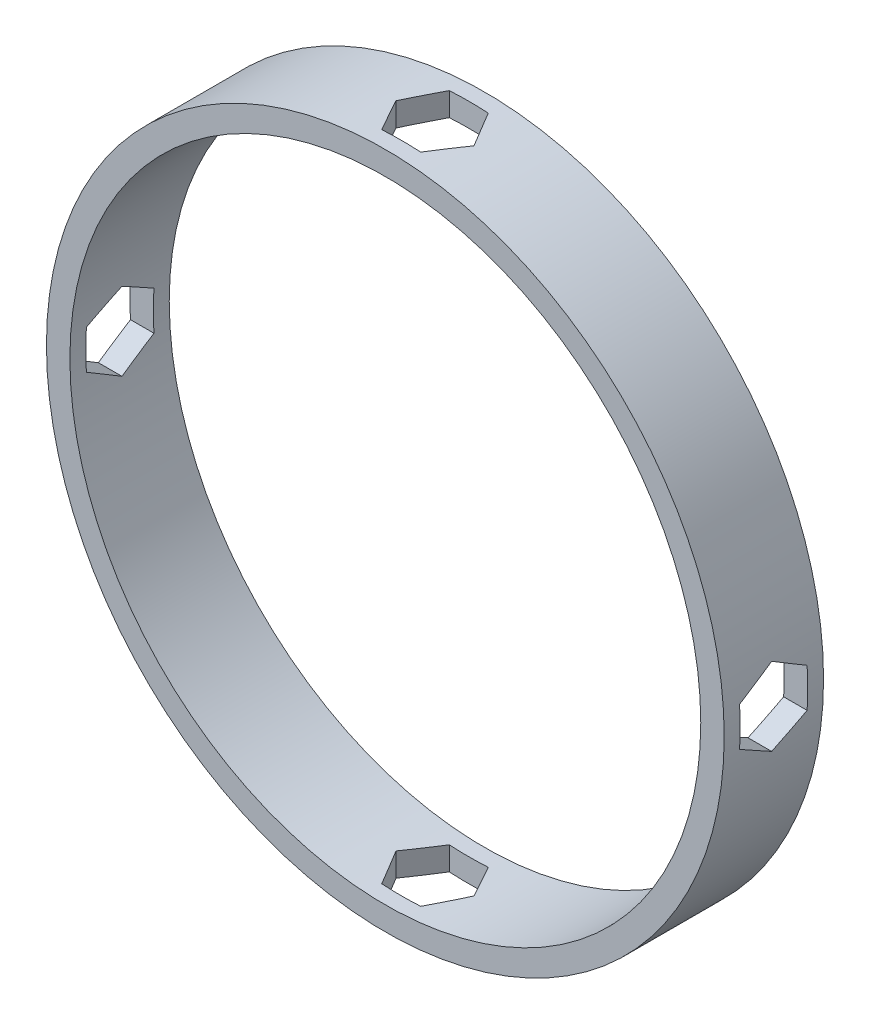
ISO-10303-21;
HEADER;
FILE_DESCRIPTION(('STEP AP214'),'2;1');
FILE_NAME('part.step','',(''),(''),'','','');
FILE_SCHEMA(('AUTOMOTIVE_DESIGN { 1 0 10303 214 1 1 1 1 }'));
ENDSEC;
DATA;
#1=APPLICATION_CONTEXT('core data for automotive mechanical design processes');
#2=APPLICATION_PROTOCOL_DEFINITION('international standard','automotive_design',2000,#1);
#3=PRODUCT_CONTEXT('',#1,'mechanical');
#4=PRODUCT('Part','Part','',(#3));
#5=PRODUCT_RELATED_PRODUCT_CATEGORY('part','',(#4));
#6=PRODUCT_DEFINITION_FORMATION('','',#4);
#7=PRODUCT_DEFINITION_CONTEXT('part definition',#1,'design');
#8=PRODUCT_DEFINITION('design','',#6,#7);
#9=PRODUCT_DEFINITION_SHAPE('','',#8);
#10=(LENGTH_UNIT() NAMED_UNIT(*) SI_UNIT(.MILLI.,.METRE.));
#11=(NAMED_UNIT(*) PLANE_ANGLE_UNIT() SI_UNIT($,.RADIAN.));
#12=(NAMED_UNIT(*) SI_UNIT($,.STERADIAN.) SOLID_ANGLE_UNIT());
#13=UNCERTAINTY_MEASURE_WITH_UNIT(LENGTH_MEASURE(1.E-05),#10,'distance_accuracy_value','');
#14=(GEOMETRIC_REPRESENTATION_CONTEXT(3) GLOBAL_UNCERTAINTY_ASSIGNED_CONTEXT((#13)) GLOBAL_UNIT_ASSIGNED_CONTEXT((#10,
#11,#12)) REPRESENTATION_CONTEXT('',''));
#15=CARTESIAN_POINT('',(0.,0.,0.));
#16=DIRECTION('',(0.,0.,1.));
#17=DIRECTION('',(1.,0.,0.));
#18=AXIS2_PLACEMENT_3D('',#15,#16,#17);
#19=CARTESIAN_POINT('',(0.,0.,11.5));
#20=DIRECTION('',(0.,0.,-1.));
#21=DIRECTION('',(-1.,0.,0.));
#22=AXIS2_PLACEMENT_3D('',#19,#20,#21);
#23=CYLINDRICAL_SURFACE('',#22,34.11);
#24=CARTESIAN_POINT('',(0.,0.,0.));
#25=DIRECTION('',(0.,0.,1.));
#26=DIRECTION('',(1.,0.,0.));
#27=AXIS2_PLACEMENT_3D('',#24,#25,#26);
#28=CIRCLE('',#27,34.11);
#29=CARTESIAN_POINT('',(34.11,0.,0.));
#30=VERTEX_POINT('',#29);
#31=EDGE_CURVE('E359',#30,#30,#28,.T.);
#32=ORIENTED_EDGE('',*,*,#31,.T.);
#33=EDGE_LOOP('',(#32));
#34=FACE_BOUND('',#33,.T.);
#35=CARTESIAN_POINT('',(0.,0.,-1.8));
#36=DIRECTION('',(-0.866025403784439,0.,-0.5));
#37=DIRECTION('',(0.5,0.,-0.866025403784439));
#38=AXIS2_PLACEMENT_3D('',#35,#36,#37);
#39=ELLIPSE('',#38,68.22,34.11);
#40=CARTESIAN_POINT('',(-3.92598183048945,33.8833110345885,5.));
#41=VERTEX_POINT('',#40);
#42=CARTESIAN_POINT('',(-1.96299091524473,34.053469231,1.6));
#43=VERTEX_POINT('',#42);
#44=EDGE_CURVE('E345',#41,#43,#39,.T.);
#45=ORIENTED_EDGE('',*,*,#44,.T.);
#46=CARTESIAN_POINT('',(0.,0.,1.6));
#47=DIRECTION('',(0.,0.,-1.));
#48=DIRECTION('',(-1.,0.,0.));
#49=AXIS2_PLACEMENT_3D('',#46,#47,#48);
#50=CIRCLE('',#49,34.11);
#51=CARTESIAN_POINT('',(1.96299091524472,34.0534692310001,1.6));
#52=VERTEX_POINT('',#51);
#53=EDGE_CURVE('E343',#43,#52,#50,.T.);
#54=ORIENTED_EDGE('',*,*,#53,.T.);
#55=CARTESIAN_POINT('',(0.,0.,-1.79999999999999));
#56=DIRECTION('',(0.866025403784438,0.,-0.500000000000001));
#57=DIRECTION('',(-0.500000000000001,0.,-0.866025403784438));
#58=AXIS2_PLACEMENT_3D('',#55,#56,#57);
#59=ELLIPSE('',#58,68.2199999999999,34.11);
#60=CARTESIAN_POINT('',(3.92598183048946,33.8833110345885,5.));
#61=VERTEX_POINT('',#60);
#62=EDGE_CURVE('E327',#52,#61,#59,.T.);
#63=ORIENTED_EDGE('',*,*,#62,.T.);
#64=CARTESIAN_POINT('',(0.,0.,11.8));
#65=DIRECTION('',(0.866025403784438,0.,0.5));
#66=DIRECTION('',(0.5,0.,-0.866025403784439));
#67=AXIS2_PLACEMENT_3D('',#64,#65,#66);
#68=ELLIPSE('',#67,68.22,34.11);
#69=CARTESIAN_POINT('',(1.96299091524473,34.053469231,8.4));
#70=VERTEX_POINT('',#69);
#71=EDGE_CURVE('E353',#61,#70,#68,.T.);
#72=ORIENTED_EDGE('',*,*,#71,.T.);
#73=CARTESIAN_POINT('',(0.,0.,8.4));
#74=DIRECTION('',(0.,0.,1.));
#75=DIRECTION('',(1.,0.,0.));
#76=AXIS2_PLACEMENT_3D('',#73,#74,#75);
#77=CIRCLE('',#76,34.11);
#78=CARTESIAN_POINT('',(-1.96299091524473,34.053469231,8.4));
#79=VERTEX_POINT('',#78);
#80=EDGE_CURVE('E351',#70,#79,#77,.T.);
#81=ORIENTED_EDGE('',*,*,#80,.T.);
#82=CARTESIAN_POINT('',(0.,0.,11.8));
#83=DIRECTION('',(-0.866025403784439,0.,0.5));
#84=DIRECTION('',(-0.5,0.,-0.866025403784439));
#85=AXIS2_PLACEMENT_3D('',#82,#83,#84);
#86=ELLIPSE('',#85,68.22,34.11);
#87=EDGE_CURVE('E348',#79,#41,#86,.T.);
#88=ORIENTED_EDGE('',*,*,#87,.T.);
#89=EDGE_LOOP('',(#45,#54,#63,#72,#81,#88));
#90=FACE_BOUND('',#89,.T.);
#91=CARTESIAN_POINT('',(0.,0.,-1.79999999999999));
#92=DIRECTION('',(0.,0.866025403784438,-0.500000000000001));
#93=DIRECTION('',(0.,-0.500000000000001,-0.866025403784438));
#94=AXIS2_PLACEMENT_3D('',#91,#92,#93);
#95=ELLIPSE('',#94,68.2199999999999,34.11);
#96=CARTESIAN_POINT('',(-34.053469231,1.96299091524508,1.6));
#97=VERTEX_POINT('',#96);
#98=CARTESIAN_POINT('',(-33.8833110345885,3.92598183048981,5.00000000000001));
#99=VERTEX_POINT('',#98);
#100=EDGE_CURVE('E279',#97,#99,#95,.T.);
#101=ORIENTED_EDGE('',*,*,#100,.T.);
#102=CARTESIAN_POINT('',(0.,0.,11.8));
#103=DIRECTION('',(0.,0.866025403784438,0.5));
#104=DIRECTION('',(0.,0.5,-0.866025403784439));
#105=AXIS2_PLACEMENT_3D('',#102,#103,#104);
#106=ELLIPSE('',#105,68.22,34.11);
#107=CARTESIAN_POINT('',(-34.053469231,1.96299091524509,8.4));
#108=VERTEX_POINT('',#107);
#109=EDGE_CURVE('E234',#99,#108,#106,.T.);
#110=ORIENTED_EDGE('',*,*,#109,.T.);
#111=CARTESIAN_POINT('',(0.,0.,8.4));
#112=DIRECTION('',(0.,0.,1.));
#113=DIRECTION('',(0.,1.,0.));
#114=AXIS2_PLACEMENT_3D('',#111,#112,#113);
#115=CIRCLE('',#114,34.11);
#116=CARTESIAN_POINT('',(-34.0534692310001,-1.96299091524437,8.4));
#117=VERTEX_POINT('',#116);
#118=EDGE_CURVE('E316',#108,#117,#115,.T.);
#119=ORIENTED_EDGE('',*,*,#118,.T.);
#120=CARTESIAN_POINT('',(0.,0.,11.8));
#121=DIRECTION('',(0.,-0.866025403784439,0.5));
#122=DIRECTION('',(0.,-0.5,-0.866025403784439));
#123=AXIS2_PLACEMENT_3D('',#120,#121,#122);
#124=ELLIPSE('',#123,68.22,34.11);
#125=CARTESIAN_POINT('',(-33.8833110345885,-3.9259818304891,5.));
#126=VERTEX_POINT('',#125);
#127=EDGE_CURVE('E308',#117,#126,#124,.T.);
#128=ORIENTED_EDGE('',*,*,#127,.T.);
#129=CARTESIAN_POINT('',(0.,0.,-1.8));
#130=DIRECTION('',(0.,-0.866025403784439,-0.5));
#131=DIRECTION('',(0.,0.5,-0.866025403784439));
#132=AXIS2_PLACEMENT_3D('',#129,#130,#131);
#133=ELLIPSE('',#132,68.22,34.11);
#134=CARTESIAN_POINT('',(-34.0534692310001,-1.96299091524437,1.6));
#135=VERTEX_POINT('',#134);
#136=EDGE_CURVE('E300',#126,#135,#133,.T.);
#137=ORIENTED_EDGE('',*,*,#136,.T.);
#138=CARTESIAN_POINT('',(0.,0.,1.6));
#139=DIRECTION('',(0.,0.,-1.));
#140=DIRECTION('',(0.,-1.,0.));
#141=AXIS2_PLACEMENT_3D('',#138,#139,#140);
#142=CIRCLE('',#141,34.11);
#143=EDGE_CURVE('E292',#135,#97,#142,.T.);
#144=ORIENTED_EDGE('',*,*,#143,.T.);
#145=EDGE_LOOP('',(#101,#110,#119,#128,#137,#144));
#146=FACE_BOUND('',#145,.T.);
#147=CARTESIAN_POINT('',(0.,0.,-1.79999999999999));
#148=DIRECTION('',(-0.866025403784438,0.,-0.500000000000001));
#149=DIRECTION('',(0.500000000000001,0.,-0.866025403784438));
#150=AXIS2_PLACEMENT_3D('',#147,#148,#149);
#151=ELLIPSE('',#150,68.2199999999999,34.11);
#152=CARTESIAN_POINT('',(-1.96299091524472,-34.0534692310001,1.6));
#153=VERTEX_POINT('',#152);
#154=CARTESIAN_POINT('',(-3.92598183048946,-33.8833110345885,5.00000000000001));
#155=VERTEX_POINT('',#154);
#156=EDGE_CURVE('E233',#153,#155,#151,.T.);
#157=ORIENTED_EDGE('',*,*,#156,.T.);
#158=CARTESIAN_POINT('',(0.,0.,11.8));
#159=DIRECTION('',(-0.866025403784438,0.,0.5));
#160=DIRECTION('',(-0.5,0.,-0.866025403784439));
#161=AXIS2_PLACEMENT_3D('',#158,#159,#160);
#162=ELLIPSE('',#161,68.22,34.11);
#163=CARTESIAN_POINT('',(-1.96299091524473,-34.053469231,8.4));
#164=VERTEX_POINT('',#163);
#165=EDGE_CURVE('E62',#155,#164,#162,.T.);
#166=ORIENTED_EDGE('',*,*,#165,.T.);
#167=CARTESIAN_POINT('',(0.,0.,8.4));
#168=DIRECTION('',(0.,0.,1.));
#169=DIRECTION('',(-1.,0.,0.));
#170=AXIS2_PLACEMENT_3D('',#167,#168,#169);
#171=CIRCLE('',#170,34.11);
#172=CARTESIAN_POINT('',(1.96299091524473,-34.053469231,8.4));
#173=VERTEX_POINT('',#172);
#174=EDGE_CURVE('E270',#164,#173,#171,.T.);
#175=ORIENTED_EDGE('',*,*,#174,.T.);
#176=CARTESIAN_POINT('',(0.,0.,11.8));
#177=DIRECTION('',(0.866025403784439,0.,0.5));
#178=DIRECTION('',(0.5,0.,-0.866025403784439));
#179=AXIS2_PLACEMENT_3D('',#176,#177,#178);
#180=ELLIPSE('',#179,68.22,34.11);
#181=CARTESIAN_POINT('',(3.92598183048945,-33.8833110345885,5.));
#182=VERTEX_POINT('',#181);
#183=EDGE_CURVE('E262',#173,#182,#180,.T.);
#184=ORIENTED_EDGE('',*,*,#183,.T.);
#185=CARTESIAN_POINT('',(0.,0.,-1.8));
#186=DIRECTION('',(0.866025403784439,0.,-0.5));
#187=DIRECTION('',(-0.5,0.,-0.866025403784439));
#188=AXIS2_PLACEMENT_3D('',#185,#186,#187);
#189=ELLIPSE('',#188,68.22,34.11);
#190=CARTESIAN_POINT('',(1.96299091524473,-34.053469231,1.6));
#191=VERTEX_POINT('',#190);
#192=EDGE_CURVE('E254',#182,#191,#189,.T.);
#193=ORIENTED_EDGE('',*,*,#192,.T.);
#194=CARTESIAN_POINT('',(0.,0.,1.6));
#195=DIRECTION('',(0.,0.,-1.));
#196=DIRECTION('',(1.,0.,0.));
#197=AXIS2_PLACEMENT_3D('',#194,#195,#196);
#198=CIRCLE('',#197,34.11);
#199=EDGE_CURVE('E246',#191,#153,#198,.T.);
#200=ORIENTED_EDGE('',*,*,#199,.T.);
#201=EDGE_LOOP('',(#157,#166,#175,#184,#193,#200));
#202=FACE_BOUND('',#201,.T.);
#203=CARTESIAN_POINT('',(0.,0.,-1.79999999999999));
#204=DIRECTION('',(0.,-0.866025403784438,-0.500000000000001));
#205=DIRECTION('',(0.,0.500000000000001,-0.866025403784438));
#206=AXIS2_PLACEMENT_3D('',#203,#204,#205);
#207=ELLIPSE('',#206,68.2199999999999,34.11);
#208=CARTESIAN_POINT('',(34.053469231,-1.96299091524484,1.6));
#209=VERTEX_POINT('',#208);
#210=CARTESIAN_POINT('',(33.8833110345885,-3.92598183048958,5.00000000000001));
#211=VERTEX_POINT('',#210);
#212=EDGE_CURVE('E210',#209,#211,#207,.T.);
#213=ORIENTED_EDGE('',*,*,#212,.T.);
#214=CARTESIAN_POINT('',(0.,0.,11.8));
#215=DIRECTION('',(0.,-0.866025403784438,0.5));
#216=DIRECTION('',(0.,-0.5,-0.866025403784439));
#217=AXIS2_PLACEMENT_3D('',#214,#215,#216);
#218=ELLIPSE('',#217,68.22,34.11);
#219=CARTESIAN_POINT('',(34.053469231,-1.96299091524485,8.4));
#220=VERTEX_POINT('',#219);
#221=EDGE_CURVE('E54',#211,#220,#218,.T.);
#222=ORIENTED_EDGE('',*,*,#221,.T.);
#223=CARTESIAN_POINT('',(0.,0.,8.4));
#224=DIRECTION('',(0.,0.,1.));
#225=DIRECTION('',(0.,-1.,0.));
#226=AXIS2_PLACEMENT_3D('',#223,#224,#225);
#227=CIRCLE('',#226,34.11);
#228=CARTESIAN_POINT('',(34.0534692310001,1.96299091524461,8.4));
#229=VERTEX_POINT('',#228);
#230=EDGE_CURVE('E223',#220,#229,#227,.T.);
#231=ORIENTED_EDGE('',*,*,#230,.T.);
#232=CARTESIAN_POINT('',(0.,0.,11.8));
#233=DIRECTION('',(0.,0.866025403784439,0.5));
#234=DIRECTION('',(0.,0.5,-0.866025403784439));
#235=AXIS2_PLACEMENT_3D('',#232,#233,#234);
#236=ELLIPSE('',#235,68.22,34.11);
#237=CARTESIAN_POINT('',(33.8833110345885,3.92598183048934,5.));
#238=VERTEX_POINT('',#237);
#239=EDGE_CURVE('E707',#229,#238,#236,.T.);
#240=ORIENTED_EDGE('',*,*,#239,.T.);
#241=CARTESIAN_POINT('',(0.,0.,-1.8));
#242=DIRECTION('',(0.,0.866025403784439,-0.5));
#243=DIRECTION('',(0.,-0.5,-0.866025403784439));
#244=AXIS2_PLACEMENT_3D('',#241,#242,#243);
#245=ELLIPSE('',#244,68.22,34.11);
#246=CARTESIAN_POINT('',(34.0534692310001,1.96299091524461,1.6));
#247=VERTEX_POINT('',#246);
#248=EDGE_CURVE('E699',#238,#247,#245,.T.);
#249=ORIENTED_EDGE('',*,*,#248,.T.);
#250=CARTESIAN_POINT('',(0.,0.,1.6));
#251=DIRECTION('',(0.,0.,-1.));
#252=DIRECTION('',(0.,1.,0.));
#253=AXIS2_PLACEMENT_3D('',#250,#251,#252);
#254=CIRCLE('',#253,34.11);
#255=EDGE_CURVE('E692',#247,#209,#254,.T.);
#256=ORIENTED_EDGE('',*,*,#255,.T.);
#257=EDGE_LOOP('',(#213,#222,#231,#240,#249,#256));
#258=FACE_BOUND('',#257,.T.);
#259=CARTESIAN_POINT('',(0.,0.,10.));
#260=DIRECTION('',(0.,0.,1.));
#261=DIRECTION('',(1.,0.,0.));
#262=AXIS2_PLACEMENT_3D('',#259,#260,#261);
#263=CIRCLE('',#262,34.11);
#264=CARTESIAN_POINT('',(34.11,0.,10.));
#265=VERTEX_POINT('',#264);
#266=EDGE_CURVE('E682',#265,#265,#263,.T.);
#267=ORIENTED_EDGE('',*,*,#266,.F.);
#268=EDGE_LOOP('',(#267));
#269=FACE_BOUND('',#268,.T.);
#270=ADVANCED_FACE('F39',(#34,#90,#146,#202,#258,#269),#23,.T.);
#271=CARTESIAN_POINT('',(0.,0.,11.5));
#272=DIRECTION('',(0.,0.,-1.));
#273=DIRECTION('',(-1.,0.,0.));
#274=AXIS2_PLACEMENT_3D('',#271,#272,#273);
#275=CYLINDRICAL_SURFACE('',#274,31.75);
#276=CARTESIAN_POINT('',(0.,0.,0.));
#277=DIRECTION('',(0.,0.,1.));
#278=DIRECTION('',(1.,0.,0.));
#279=AXIS2_PLACEMENT_3D('',#276,#277,#278);
#280=CIRCLE('',#279,31.75);
#281=CARTESIAN_POINT('',(31.75,0.,0.));
#282=VERTEX_POINT('',#281);
#283=EDGE_CURVE('E356',#282,#282,#280,.T.);
#284=ORIENTED_EDGE('',*,*,#283,.F.);
#285=EDGE_LOOP('',(#284));
#286=FACE_BOUND('',#285,.T.);
#287=CARTESIAN_POINT('',(0.,0.,11.8));
#288=DIRECTION('',(0.866025403784438,0.,0.5));
#289=DIRECTION('',(0.5,0.,-0.866025403784439));
#290=AXIS2_PLACEMENT_3D('',#287,#288,#289);
#291=ELLIPSE('',#290,63.5,31.75);
#292=CARTESIAN_POINT('',(3.92598183048946,31.5063353417478,5.));
#293=VERTEX_POINT('',#292);
#294=CARTESIAN_POINT('',(1.96299091524473,31.6892594843532,8.4));
#295=VERTEX_POINT('',#294);
#296=EDGE_CURVE('E11',#293,#295,#291,.T.);
#297=ORIENTED_EDGE('',*,*,#296,.F.);
#298=CARTESIAN_POINT('',(0.,0.,-1.79999999999999));
#299=DIRECTION('',(0.866025403784438,0.,-0.500000000000001));
#300=DIRECTION('',(-0.500000000000001,0.,-0.866025403784438));
#301=AXIS2_PLACEMENT_3D('',#298,#299,#300);
#302=ELLIPSE('',#301,63.4999999999999,31.75);
#303=CARTESIAN_POINT('',(1.96299091524472,31.6892594843532,1.6));
#304=VERTEX_POINT('',#303);
#305=EDGE_CURVE('E362',#304,#293,#302,.T.);
#306=ORIENTED_EDGE('',*,*,#305,.F.);
#307=CARTESIAN_POINT('',(0.,0.,1.6));
#308=DIRECTION('',(0.,0.,-1.));
#309=DIRECTION('',(-1.,0.,0.));
#310=AXIS2_PLACEMENT_3D('',#307,#308,#309);
#311=CIRCLE('',#310,31.75);
#312=CARTESIAN_POINT('',(-1.96299091524473,31.6892594843532,1.6));
#313=VERTEX_POINT('',#312);
#314=EDGE_CURVE('E364',#313,#304,#311,.T.);
#315=ORIENTED_EDGE('',*,*,#314,.F.);
#316=CARTESIAN_POINT('',(0.,0.,-1.8));
#317=DIRECTION('',(-0.866025403784439,0.,-0.5));
#318=DIRECTION('',(0.5,0.,-0.866025403784439));
#319=AXIS2_PLACEMENT_3D('',#316,#317,#318);
#320=ELLIPSE('',#319,63.5,31.75);
#321=CARTESIAN_POINT('',(-3.92598183048945,31.5063353417478,5.));
#322=VERTEX_POINT('',#321);
#323=EDGE_CURVE('E367',#322,#313,#320,.T.);
#324=ORIENTED_EDGE('',*,*,#323,.F.);
#325=CARTESIAN_POINT('',(0.,0.,11.8));
#326=DIRECTION('',(-0.866025403784439,0.,0.5));
#327=DIRECTION('',(-0.5,0.,-0.866025403784439));
#328=AXIS2_PLACEMENT_3D('',#325,#326,#327);
#329=ELLIPSE('',#328,63.5,31.75);
#330=CARTESIAN_POINT('',(-1.96299091524473,31.6892594843532,8.4));
#331=VERTEX_POINT('',#330);
#332=EDGE_CURVE('E369',#331,#322,#329,.T.);
#333=ORIENTED_EDGE('',*,*,#332,.F.);
#334=CARTESIAN_POINT('',(0.,0.,8.4));
#335=DIRECTION('',(0.,0.,1.));
#336=DIRECTION('',(1.,0.,0.));
#337=AXIS2_PLACEMENT_3D('',#334,#335,#336);
#338=CIRCLE('',#337,31.75);
#339=EDGE_CURVE('E47',#295,#331,#338,.T.);
#340=ORIENTED_EDGE('',*,*,#339,.F.);
#341=EDGE_LOOP('',(#297,#306,#315,#324,#333,#340));
#342=FACE_BOUND('',#341,.T.);
#343=CARTESIAN_POINT('',(0.,0.,11.8));
#344=DIRECTION('',(0.,0.866025403784438,0.5));
#345=DIRECTION('',(0.,0.5,-0.866025403784439));
#346=AXIS2_PLACEMENT_3D('',#343,#344,#345);
#347=ELLIPSE('',#346,63.5,31.75);
#348=CARTESIAN_POINT('',(-31.5063353417478,3.92598183048979,5.));
#349=VERTEX_POINT('',#348);
#350=CARTESIAN_POINT('',(-31.6892594843531,1.96299091524506,8.4));
#351=VERTEX_POINT('',#350);
#352=EDGE_CURVE('E319',#349,#351,#347,.T.);
#353=ORIENTED_EDGE('',*,*,#352,.F.);
#354=CARTESIAN_POINT('',(0.,0.,-1.79999999999999));
#355=DIRECTION('',(0.,0.866025403784438,-0.500000000000001));
#356=DIRECTION('',(0.,-0.500000000000001,-0.866025403784438));
#357=AXIS2_PLACEMENT_3D('',#354,#355,#356);
#358=ELLIPSE('',#357,63.4999999999999,31.75);
#359=CARTESIAN_POINT('',(-31.6892594843531,1.96299091524506,1.6));
#360=VERTEX_POINT('',#359);
#361=EDGE_CURVE('E277',#360,#349,#358,.T.);
#362=ORIENTED_EDGE('',*,*,#361,.F.);
#363=CARTESIAN_POINT('',(0.,0.,1.6));
#364=DIRECTION('',(0.,0.,-1.));
#365=DIRECTION('',(0.,-1.,0.));
#366=AXIS2_PLACEMENT_3D('',#363,#364,#365);
#367=CIRCLE('',#366,31.75);
#368=CARTESIAN_POINT('',(-31.6892594843532,-1.96299091524439,1.6));
#369=VERTEX_POINT('',#368);
#370=EDGE_CURVE('E290',#369,#360,#367,.T.);
#371=ORIENTED_EDGE('',*,*,#370,.F.);
#372=CARTESIAN_POINT('',(0.,0.,-1.8));
#373=DIRECTION('',(0.,-0.866025403784439,-0.5));
#374=DIRECTION('',(0.,0.5,-0.866025403784439));
#375=AXIS2_PLACEMENT_3D('',#372,#373,#374);
#376=ELLIPSE('',#375,63.5,31.75);
#377=CARTESIAN_POINT('',(-31.5063353417478,-3.92598183048912,5.));
#378=VERTEX_POINT('',#377);
#379=EDGE_CURVE('E297',#378,#369,#376,.T.);
#380=ORIENTED_EDGE('',*,*,#379,.F.);
#381=CARTESIAN_POINT('',(0.,0.,11.8));
#382=DIRECTION('',(0.,-0.866025403784439,0.5));
#383=DIRECTION('',(0.,-0.5,-0.866025403784439));
#384=AXIS2_PLACEMENT_3D('',#381,#382,#383);
#385=ELLIPSE('',#384,63.5,31.75);
#386=CARTESIAN_POINT('',(-31.6892594843532,-1.96299091524439,8.4));
#387=VERTEX_POINT('',#386);
#388=EDGE_CURVE('E305',#387,#378,#385,.T.);
#389=ORIENTED_EDGE('',*,*,#388,.F.);
#390=CARTESIAN_POINT('',(0.,0.,8.4));
#391=DIRECTION('',(0.,0.,1.));
#392=DIRECTION('',(0.,1.,0.));
#393=AXIS2_PLACEMENT_3D('',#390,#391,#392);
#394=CIRCLE('',#393,31.75);
#395=EDGE_CURVE('E313',#351,#387,#394,.T.);
#396=ORIENTED_EDGE('',*,*,#395,.F.);
#397=EDGE_LOOP('',(#353,#362,#371,#380,#389,#396));
#398=FACE_BOUND('',#397,.T.);
#399=CARTESIAN_POINT('',(0.,0.,11.8));
#400=DIRECTION('',(-0.866025403784438,0.,0.5));
#401=DIRECTION('',(-0.5,0.,-0.866025403784439));
#402=AXIS2_PLACEMENT_3D('',#399,#400,#401);
#403=ELLIPSE('',#402,63.5,31.75);
#404=CARTESIAN_POINT('',(-3.92598183048946,-31.5063353417478,5.));
#405=VERTEX_POINT('',#404);
#406=CARTESIAN_POINT('',(-1.96299091524473,-31.6892594843532,8.4));
#407=VERTEX_POINT('',#406);
#408=EDGE_CURVE('E273',#405,#407,#403,.T.);
#409=ORIENTED_EDGE('',*,*,#408,.F.);
#410=CARTESIAN_POINT('',(0.,0.,-1.79999999999999));
#411=DIRECTION('',(-0.866025403784438,0.,-0.500000000000001));
#412=DIRECTION('',(0.500000000000001,0.,-0.866025403784438));
#413=AXIS2_PLACEMENT_3D('',#410,#411,#412);
#414=ELLIPSE('',#413,63.4999999999999,31.75);
#415=CARTESIAN_POINT('',(-1.96299091524472,-31.6892594843532,1.6));
#416=VERTEX_POINT('',#415);
#417=EDGE_CURVE('E231',#416,#405,#414,.T.);
#418=ORIENTED_EDGE('',*,*,#417,.F.);
#419=CARTESIAN_POINT('',(0.,0.,1.6));
#420=DIRECTION('',(0.,0.,-1.));
#421=DIRECTION('',(1.,0.,0.));
#422=AXIS2_PLACEMENT_3D('',#419,#420,#421);
#423=CIRCLE('',#422,31.75);
#424=CARTESIAN_POINT('',(1.96299091524473,-31.6892594843532,1.6));
#425=VERTEX_POINT('',#424);
#426=EDGE_CURVE('E244',#425,#416,#423,.T.);
#427=ORIENTED_EDGE('',*,*,#426,.F.);
#428=CARTESIAN_POINT('',(0.,0.,-1.8));
#429=DIRECTION('',(0.866025403784439,0.,-0.5));
#430=DIRECTION('',(-0.5,0.,-0.866025403784439));
#431=AXIS2_PLACEMENT_3D('',#428,#429,#430);
#432=ELLIPSE('',#431,63.5,31.75);
#433=CARTESIAN_POINT('',(3.92598183048945,-31.5063353417478,5.));
#434=VERTEX_POINT('',#433);
#435=EDGE_CURVE('E251',#434,#425,#432,.T.);
#436=ORIENTED_EDGE('',*,*,#435,.F.);
#437=CARTESIAN_POINT('',(0.,0.,11.8));
#438=DIRECTION('',(0.866025403784439,0.,0.5));
#439=DIRECTION('',(0.5,0.,-0.866025403784439));
#440=AXIS2_PLACEMENT_3D('',#437,#438,#439);
#441=ELLIPSE('',#440,63.5,31.75);
#442=CARTESIAN_POINT('',(1.96299091524473,-31.6892594843532,8.4));
#443=VERTEX_POINT('',#442);
#444=EDGE_CURVE('E259',#443,#434,#441,.T.);
#445=ORIENTED_EDGE('',*,*,#444,.F.);
#446=CARTESIAN_POINT('',(0.,0.,8.4));
#447=DIRECTION('',(0.,0.,1.));
#448=DIRECTION('',(-1.,0.,0.));
#449=AXIS2_PLACEMENT_3D('',#446,#447,#448);
#450=CIRCLE('',#449,31.75);
#451=EDGE_CURVE('E267',#407,#443,#450,.T.);
#452=ORIENTED_EDGE('',*,*,#451,.F.);
#453=EDGE_LOOP('',(#409,#418,#427,#436,#445,#452));
#454=FACE_BOUND('',#453,.T.);
#455=CARTESIAN_POINT('',(0.,0.,11.8));
#456=DIRECTION('',(0.,-0.866025403784438,0.5));
#457=DIRECTION('',(0.,-0.5,-0.866025403784439));
#458=AXIS2_PLACEMENT_3D('',#455,#456,#457);
#459=ELLIPSE('',#458,63.5,31.75);
#460=CARTESIAN_POINT('',(31.5063353417478,-3.92598183048957,5.));
#461=VERTEX_POINT('',#460);
#462=CARTESIAN_POINT('',(31.6892594843532,-1.96299091524484,8.4));
#463=VERTEX_POINT('',#462);
#464=EDGE_CURVE('E214',#461,#463,#459,.T.);
#465=ORIENTED_EDGE('',*,*,#464,.F.);
#466=CARTESIAN_POINT('',(0.,0.,-1.79999999999999));
#467=DIRECTION('',(0.,-0.866025403784438,-0.500000000000001));
#468=DIRECTION('',(0.,0.500000000000001,-0.866025403784438));
#469=AXIS2_PLACEMENT_3D('',#466,#467,#468);
#470=ELLIPSE('',#469,63.4999999999999,31.75);
#471=CARTESIAN_POINT('',(31.6892594843532,-1.96299091524484,1.6));
#472=VERTEX_POINT('',#471);
#473=EDGE_CURVE('E201',#472,#461,#470,.T.);
#474=ORIENTED_EDGE('',*,*,#473,.F.);
#475=CARTESIAN_POINT('',(0.,0.,1.6));
#476=DIRECTION('',(0.,0.,-1.));
#477=DIRECTION('',(0.,1.,0.));
#478=AXIS2_PLACEMENT_3D('',#475,#476,#477);
#479=CIRCLE('',#478,31.75);
#480=CARTESIAN_POINT('',(31.6892594843532,1.96299091524462,1.6));
#481=VERTEX_POINT('',#480);
#482=EDGE_CURVE('E690',#481,#472,#479,.T.);
#483=ORIENTED_EDGE('',*,*,#482,.F.);
#484=CARTESIAN_POINT('',(0.,0.,-1.8));
#485=DIRECTION('',(0.,0.866025403784439,-0.5));
#486=DIRECTION('',(0.,-0.5,-0.866025403784439));
#487=AXIS2_PLACEMENT_3D('',#484,#485,#486);
#488=ELLIPSE('',#487,63.5,31.75);
#489=CARTESIAN_POINT('',(31.5063353417478,3.92598183048934,5.));
#490=VERTEX_POINT('',#489);
#491=EDGE_CURVE('E696',#490,#481,#488,.T.);
#492=ORIENTED_EDGE('',*,*,#491,.F.);
#493=CARTESIAN_POINT('',(0.,0.,11.8));
#494=DIRECTION('',(0.,0.866025403784439,0.5));
#495=DIRECTION('',(0.,0.5,-0.866025403784439));
#496=AXIS2_PLACEMENT_3D('',#493,#494,#495);
#497=ELLIPSE('',#496,63.5,31.75);
#498=CARTESIAN_POINT('',(31.6892594843532,1.96299091524462,8.4));
#499=VERTEX_POINT('',#498);
#500=EDGE_CURVE('E704',#499,#490,#497,.T.);
#501=ORIENTED_EDGE('',*,*,#500,.F.);
#502=CARTESIAN_POINT('',(0.,0.,8.4));
#503=DIRECTION('',(0.,0.,1.));
#504=DIRECTION('',(0.,-1.,0.));
#505=AXIS2_PLACEMENT_3D('',#502,#503,#504);
#506=CIRCLE('',#505,31.75);
#507=EDGE_CURVE('E222',#463,#499,#506,.T.);
#508=ORIENTED_EDGE('',*,*,#507,.F.);
#509=EDGE_LOOP('',(#465,#474,#483,#492,#501,#508));
#510=FACE_BOUND('',#509,.T.);
#511=CARTESIAN_POINT('',(0.,0.,10.));
#512=DIRECTION('',(0.,0.,1.));
#513=DIRECTION('',(1.,0.,0.));
#514=AXIS2_PLACEMENT_3D('',#511,#512,#513);
#515=CIRCLE('',#514,31.75);
#516=CARTESIAN_POINT('',(31.75,0.,10.));
#517=VERTEX_POINT('',#516);
#518=EDGE_CURVE('E42',#517,#517,#515,.T.);
#519=ORIENTED_EDGE('',*,*,#518,.T.);
#520=EDGE_LOOP('',(#519));
#521=FACE_BOUND('',#520,.T.);
#522=ADVANCED_FACE('F218',(#286,#342,#398,#454,#510,#521),#275,.F.);
#523=CARTESIAN_POINT('',(0.,0.,0.));
#524=DIRECTION('',(0.,0.,1.));
#525=DIRECTION('',(1.,0.,0.));
#526=AXIS2_PLACEMENT_3D('',#523,#524,#525);
#527=PLANE('',#526);
#528=ORIENTED_EDGE('',*,*,#31,.F.);
#529=EDGE_LOOP('',(#528));
#530=FACE_BOUND('',#529,.T.);
#531=ORIENTED_EDGE('',*,*,#283,.T.);
#532=EDGE_LOOP('',(#531));
#533=FACE_BOUND('',#532,.T.);
#534=ADVANCED_FACE('F402',(#530,#533),#527,.F.);
#535=CARTESIAN_POINT('',(1.96299091524473,24.11,8.4));
#536=DIRECTION('',(0.866025403784438,0.,0.5));
#537=DIRECTION('',(0.5,0.,-0.866025403784439));
#538=AXIS2_PLACEMENT_3D('',#535,#536,#537);
#539=PLANE('',#538);
#540=DIRECTION('',(0.,1.,0.));
#541=VECTOR('',#540,1.);
#542=CARTESIAN_POINT('',(3.92598183048946,24.11,5.));
#543=LINE('',#542,#541);
#544=EDGE_CURVE('E225',#293,#61,#543,.T.);
#545=ORIENTED_EDGE('',*,*,#544,.F.);
#546=ORIENTED_EDGE('',*,*,#296,.T.);
#547=DIRECTION('',(0.,1.,0.));
#548=VECTOR('',#547,1.);
#549=CARTESIAN_POINT('',(1.96299091524473,24.11,8.4));
#550=LINE('',#549,#548);
#551=EDGE_CURVE('E324',#295,#70,#550,.T.);
#552=ORIENTED_EDGE('',*,*,#551,.T.);
#553=ORIENTED_EDGE('',*,*,#71,.F.);
#554=EDGE_LOOP('',(#545,#546,#552,#553));
#555=FACE_BOUND('',#554,.T.);
#556=ADVANCED_FACE('F400',(#555),#539,.F.);
#557=CARTESIAN_POINT('',(-1.96299091524473,24.11,8.4));
#558=DIRECTION('',(0.,0.,1.));
#559=DIRECTION('',(1.,0.,0.));
#560=AXIS2_PLACEMENT_3D('',#557,#558,#559);
#561=PLANE('',#560);
#562=ORIENTED_EDGE('',*,*,#551,.F.);
#563=ORIENTED_EDGE('',*,*,#339,.T.);
#564=DIRECTION('',(0.,1.,0.));
#565=VECTOR('',#564,1.);
#566=CARTESIAN_POINT('',(-1.96299091524473,24.11,8.4));
#567=LINE('',#566,#565);
#568=EDGE_CURVE('E328',#331,#79,#567,.T.);
#569=ORIENTED_EDGE('',*,*,#568,.T.);
#570=ORIENTED_EDGE('',*,*,#80,.F.);
#571=EDGE_LOOP('',(#562,#563,#569,#570));
#572=FACE_BOUND('',#571,.T.);
#573=ADVANCED_FACE('F375',(#572),#561,.F.);
#574=CARTESIAN_POINT('',(-3.92598183048945,24.11,5.));
#575=DIRECTION('',(-0.866025403784439,0.,0.5));
#576=DIRECTION('',(0.5,0.,0.866025403784439));
#577=AXIS2_PLACEMENT_3D('',#574,#575,#576);
#578=PLANE('',#577);
#579=ORIENTED_EDGE('',*,*,#568,.F.);
#580=ORIENTED_EDGE('',*,*,#332,.T.);
#581=DIRECTION('',(0.,1.,0.));
#582=VECTOR('',#581,1.);
#583=CARTESIAN_POINT('',(-3.92598183048945,24.11,5.));
#584=LINE('',#583,#582);
#585=EDGE_CURVE('E331',#322,#41,#584,.T.);
#586=ORIENTED_EDGE('',*,*,#585,.T.);
#587=ORIENTED_EDGE('',*,*,#87,.F.);
#588=EDGE_LOOP('',(#579,#580,#586,#587));
#589=FACE_BOUND('',#588,.T.);
#590=ADVANCED_FACE('F381',(#589),#578,.F.);
#591=CARTESIAN_POINT('',(-1.96299091524473,24.11,1.6));
#592=DIRECTION('',(-0.866025403784439,0.,-0.5));
#593=DIRECTION('',(-0.5,0.,0.866025403784439));
#594=AXIS2_PLACEMENT_3D('',#591,#592,#593);
#595=PLANE('',#594);
#596=ORIENTED_EDGE('',*,*,#585,.F.);
#597=ORIENTED_EDGE('',*,*,#323,.T.);
#598=DIRECTION('',(0.,1.,0.));
#599=VECTOR('',#598,1.);
#600=CARTESIAN_POINT('',(-1.96299091524473,24.11,1.6));
#601=LINE('',#600,#599);
#602=EDGE_CURVE('E334',#313,#43,#601,.T.);
#603=ORIENTED_EDGE('',*,*,#602,.T.);
#604=ORIENTED_EDGE('',*,*,#44,.F.);
#605=EDGE_LOOP('',(#596,#597,#603,#604));
#606=FACE_BOUND('',#605,.T.);
#607=ADVANCED_FACE('F389',(#606),#595,.F.);
#608=CARTESIAN_POINT('',(1.96299091524472,24.11,1.6));
#609=DIRECTION('',(0.,0.,-1.));
#610=DIRECTION('',(-1.,0.,0.));
#611=AXIS2_PLACEMENT_3D('',#608,#609,#610);
#612=PLANE('',#611);
#613=ORIENTED_EDGE('',*,*,#602,.F.);
#614=ORIENTED_EDGE('',*,*,#314,.T.);
#615=DIRECTION('',(0.,1.,0.));
#616=VECTOR('',#615,1.);
#617=CARTESIAN_POINT('',(1.96299091524472,24.11,1.6));
#618=LINE('',#617,#616);
#619=EDGE_CURVE('E337',#304,#52,#618,.T.);
#620=ORIENTED_EDGE('',*,*,#619,.T.);
#621=ORIENTED_EDGE('',*,*,#53,.F.);
#622=EDGE_LOOP('',(#613,#614,#620,#621));
#623=FACE_BOUND('',#622,.T.);
#624=ADVANCED_FACE('F391',(#623),#612,.F.);
#625=CARTESIAN_POINT('',(3.92598183048946,24.11,5.));
#626=DIRECTION('',(0.866025403784438,0.,-0.500000000000001));
#627=DIRECTION('',(-0.500000000000001,0.,-0.866025403784438));
#628=AXIS2_PLACEMENT_3D('',#625,#626,#627);
#629=PLANE('',#628);
#630=ORIENTED_EDGE('',*,*,#619,.F.);
#631=ORIENTED_EDGE('',*,*,#305,.T.);
#632=ORIENTED_EDGE('',*,*,#544,.T.);
#633=ORIENTED_EDGE('',*,*,#62,.F.);
#634=EDGE_LOOP('',(#630,#631,#632,#633));
#635=FACE_BOUND('',#634,.T.);
#636=ADVANCED_FACE('F396',(#635),#629,.F.);
#637=CARTESIAN_POINT('',(-24.11,1.96299091524498,8.4));
#638=DIRECTION('',(0.,0.866025403784438,0.5));
#639=DIRECTION('',(0.,0.5,-0.866025403784439));
#640=AXIS2_PLACEMENT_3D('',#637,#638,#639);
#641=PLANE('',#640);
#642=DIRECTION('',(-1.,0.,0.));
#643=VECTOR('',#642,1.);
#644=CARTESIAN_POINT('',(-24.11,3.92598183048971,5.));
#645=LINE('',#644,#643);
#646=EDGE_CURVE('E285',#349,#99,#645,.T.);
#647=ORIENTED_EDGE('',*,*,#646,.F.);
#648=ORIENTED_EDGE('',*,*,#352,.T.);
#649=DIRECTION('',(-1.,0.,0.));
#650=VECTOR('',#649,1.);
#651=CARTESIAN_POINT('',(-24.11,1.96299091524498,8.4));
#652=LINE('',#651,#650);
#653=EDGE_CURVE('E311',#351,#108,#652,.T.);
#654=ORIENTED_EDGE('',*,*,#653,.T.);
#655=ORIENTED_EDGE('',*,*,#109,.F.);
#656=EDGE_LOOP('',(#647,#648,#654,#655));
#657=FACE_BOUND('',#656,.T.);
#658=ADVANCED_FACE('F605',(#657),#641,.F.);
#659=CARTESIAN_POINT('',(-24.11,-1.96299091524447,8.4));
#660=DIRECTION('',(0.,0.,1.));
#661=DIRECTION('',(0.,1.,0.));
#662=AXIS2_PLACEMENT_3D('',#659,#660,#661);
#663=PLANE('',#662);
#664=ORIENTED_EDGE('',*,*,#653,.F.);
#665=ORIENTED_EDGE('',*,*,#395,.T.);
#666=DIRECTION('',(-1.,0.,0.));
#667=VECTOR('',#666,1.);
#668=CARTESIAN_POINT('',(-24.11,-1.96299091524447,8.4));
#669=LINE('',#668,#667);
#670=EDGE_CURVE('E303',#387,#117,#669,.T.);
#671=ORIENTED_EDGE('',*,*,#670,.T.);
#672=ORIENTED_EDGE('',*,*,#118,.F.);
#673=EDGE_LOOP('',(#664,#665,#671,#672));
#674=FACE_BOUND('',#673,.T.);
#675=ADVANCED_FACE('F595',(#674),#663,.F.);
#676=CARTESIAN_POINT('',(-24.11,-3.9259818304892,5.));
#677=DIRECTION('',(0.,-0.866025403784439,0.5));
#678=DIRECTION('',(0.,0.5,0.866025403784439));
#679=AXIS2_PLACEMENT_3D('',#676,#677,#678);
#680=PLANE('',#679);
#681=ORIENTED_EDGE('',*,*,#670,.F.);
#682=ORIENTED_EDGE('',*,*,#388,.T.);
#683=DIRECTION('',(-1.,0.,0.));
#684=VECTOR('',#683,1.);
#685=CARTESIAN_POINT('',(-24.11,-3.9259818304892,5.));
#686=LINE('',#685,#684);
#687=EDGE_CURVE('E295',#378,#126,#686,.T.);
#688=ORIENTED_EDGE('',*,*,#687,.T.);
#689=ORIENTED_EDGE('',*,*,#127,.F.);
#690=EDGE_LOOP('',(#681,#682,#688,#689));
#691=FACE_BOUND('',#690,.T.);
#692=ADVANCED_FACE('F585',(#691),#680,.F.);
#693=CARTESIAN_POINT('',(-24.11,-1.96299091524447,1.6));
#694=DIRECTION('',(0.,-0.866025403784439,-0.5));
#695=DIRECTION('',(0.,-0.5,0.866025403784439));
#696=AXIS2_PLACEMENT_3D('',#693,#694,#695);
#697=PLANE('',#696);
#698=ORIENTED_EDGE('',*,*,#687,.F.);
#699=ORIENTED_EDGE('',*,*,#379,.T.);
#700=DIRECTION('',(-1.,0.,0.));
#701=VECTOR('',#700,1.);
#702=CARTESIAN_POINT('',(-24.11,-1.96299091524447,1.6));
#703=LINE('',#702,#701);
#704=EDGE_CURVE('E288',#369,#135,#703,.T.);
#705=ORIENTED_EDGE('',*,*,#704,.T.);
#706=ORIENTED_EDGE('',*,*,#136,.F.);
#707=EDGE_LOOP('',(#698,#699,#705,#706));
#708=FACE_BOUND('',#707,.T.);
#709=ADVANCED_FACE('F575',(#708),#697,.F.);
#710=CARTESIAN_POINT('',(-24.11,1.96299091524498,1.6));
#711=DIRECTION('',(0.,0.,-1.));
#712=DIRECTION('',(0.,-1.,0.));
#713=AXIS2_PLACEMENT_3D('',#710,#711,#712);
#714=PLANE('',#713);
#715=ORIENTED_EDGE('',*,*,#704,.F.);
#716=ORIENTED_EDGE('',*,*,#370,.T.);
#717=DIRECTION('',(-1.,0.,0.));
#718=VECTOR('',#717,1.);
#719=CARTESIAN_POINT('',(-24.11,1.96299091524498,1.6));
#720=LINE('',#719,#718);
#721=EDGE_CURVE('E282',#360,#97,#720,.T.);
#722=ORIENTED_EDGE('',*,*,#721,.T.);
#723=ORIENTED_EDGE('',*,*,#143,.F.);
#724=EDGE_LOOP('',(#715,#716,#722,#723));
#725=FACE_BOUND('',#724,.T.);
#726=ADVANCED_FACE('F565',(#725),#714,.F.);
#727=CARTESIAN_POINT('',(-24.11,3.92598183048971,5.));
#728=DIRECTION('',(0.,0.866025403784438,-0.500000000000001));
#729=DIRECTION('',(0.,-0.500000000000001,-0.866025403784438));
#730=AXIS2_PLACEMENT_3D('',#727,#728,#729);
#731=PLANE('',#730);
#732=ORIENTED_EDGE('',*,*,#721,.F.);
#733=ORIENTED_EDGE('',*,*,#361,.T.);
#734=ORIENTED_EDGE('',*,*,#646,.T.);
#735=ORIENTED_EDGE('',*,*,#100,.F.);
#736=EDGE_LOOP('',(#732,#733,#734,#735));
#737=FACE_BOUND('',#736,.T.);
#738=ADVANCED_FACE('F557',(#737),#731,.F.);
#739=CARTESIAN_POINT('',(-1.96299091524473,-24.11,8.4));
#740=DIRECTION('',(-0.866025403784438,0.,0.5));
#741=DIRECTION('',(-0.5,0.,-0.866025403784439));
#742=AXIS2_PLACEMENT_3D('',#739,#740,#741);
#743=PLANE('',#742);
#744=DIRECTION('',(0.,-1.,0.));
#745=VECTOR('',#744,1.);
#746=CARTESIAN_POINT('',(-3.92598183048946,-24.11,5.));
#747=LINE('',#746,#745);
#748=EDGE_CURVE('E240',#405,#155,#747,.T.);
#749=ORIENTED_EDGE('',*,*,#748,.F.);
#750=ORIENTED_EDGE('',*,*,#408,.T.);
#751=DIRECTION('',(0.,-1.,0.));
#752=VECTOR('',#751,1.);
#753=CARTESIAN_POINT('',(-1.96299091524473,-24.11,8.4));
#754=LINE('',#753,#752);
#755=EDGE_CURVE('E265',#407,#164,#754,.T.);
#756=ORIENTED_EDGE('',*,*,#755,.T.);
#757=ORIENTED_EDGE('',*,*,#165,.F.);
#758=EDGE_LOOP('',(#749,#750,#756,#757));
#759=FACE_BOUND('',#758,.T.);
#760=ADVANCED_FACE('F548',(#759),#743,.F.);
#761=CARTESIAN_POINT('',(1.96299091524473,-24.11,8.4));
#762=DIRECTION('',(0.,0.,1.));
#763=DIRECTION('',(-1.,0.,0.));
#764=AXIS2_PLACEMENT_3D('',#761,#762,#763);
#765=PLANE('',#764);
#766=ORIENTED_EDGE('',*,*,#755,.F.);
#767=ORIENTED_EDGE('',*,*,#451,.T.);
#768=DIRECTION('',(0.,-1.,0.));
#769=VECTOR('',#768,1.);
#770=CARTESIAN_POINT('',(1.96299091524473,-24.11,8.4));
#771=LINE('',#770,#769);
#772=EDGE_CURVE('E257',#443,#173,#771,.T.);
#773=ORIENTED_EDGE('',*,*,#772,.T.);
#774=ORIENTED_EDGE('',*,*,#174,.F.);
#775=EDGE_LOOP('',(#766,#767,#773,#774));
#776=FACE_BOUND('',#775,.T.);
#777=ADVANCED_FACE('F538',(#776),#765,.F.);
#778=CARTESIAN_POINT('',(3.92598183048945,-24.11,5.));
#779=DIRECTION('',(0.866025403784439,0.,0.5));
#780=DIRECTION('',(-0.5,0.,0.866025403784439));
#781=AXIS2_PLACEMENT_3D('',#778,#779,#780);
#782=PLANE('',#781);
#783=ORIENTED_EDGE('',*,*,#772,.F.);
#784=ORIENTED_EDGE('',*,*,#444,.T.);
#785=DIRECTION('',(0.,-1.,0.));
#786=VECTOR('',#785,1.);
#787=CARTESIAN_POINT('',(3.92598183048945,-24.11,5.));
#788=LINE('',#787,#786);
#789=EDGE_CURVE('E249',#434,#182,#788,.T.);
#790=ORIENTED_EDGE('',*,*,#789,.T.);
#791=ORIENTED_EDGE('',*,*,#183,.F.);
#792=EDGE_LOOP('',(#783,#784,#790,#791));
#793=FACE_BOUND('',#792,.T.);
#794=ADVANCED_FACE('F528',(#793),#782,.F.);
#795=CARTESIAN_POINT('',(1.96299091524473,-24.11,1.6));
#796=DIRECTION('',(0.866025403784439,0.,-0.5));
#797=DIRECTION('',(0.5,0.,0.866025403784439));
#798=AXIS2_PLACEMENT_3D('',#795,#796,#797);
#799=PLANE('',#798);
#800=ORIENTED_EDGE('',*,*,#789,.F.);
#801=ORIENTED_EDGE('',*,*,#435,.T.);
#802=DIRECTION('',(0.,-1.,0.));
#803=VECTOR('',#802,1.);
#804=CARTESIAN_POINT('',(1.96299091524473,-24.11,1.6));
#805=LINE('',#804,#803);
#806=EDGE_CURVE('E242',#425,#191,#805,.T.);
#807=ORIENTED_EDGE('',*,*,#806,.T.);
#808=ORIENTED_EDGE('',*,*,#192,.F.);
#809=EDGE_LOOP('',(#800,#801,#807,#808));
#810=FACE_BOUND('',#809,.T.);
#811=ADVANCED_FACE('F518',(#810),#799,.F.);
#812=CARTESIAN_POINT('',(-1.96299091524472,-24.11,1.6));
#813=DIRECTION('',(0.,0.,-1.));
#814=DIRECTION('',(1.,0.,0.));
#815=AXIS2_PLACEMENT_3D('',#812,#813,#814);
#816=PLANE('',#815);
#817=ORIENTED_EDGE('',*,*,#806,.F.);
#818=ORIENTED_EDGE('',*,*,#426,.T.);
#819=DIRECTION('',(0.,-1.,0.));
#820=VECTOR('',#819,1.);
#821=CARTESIAN_POINT('',(-1.96299091524472,-24.11,1.6));
#822=LINE('',#821,#820);
#823=EDGE_CURVE('E237',#416,#153,#822,.T.);
#824=ORIENTED_EDGE('',*,*,#823,.T.);
#825=ORIENTED_EDGE('',*,*,#199,.F.);
#826=EDGE_LOOP('',(#817,#818,#824,#825));
#827=FACE_BOUND('',#826,.T.);
#828=ADVANCED_FACE('F507',(#827),#816,.F.);
#829=CARTESIAN_POINT('',(-3.92598183048946,-24.11,5.));
#830=DIRECTION('',(-0.866025403784438,0.,-0.500000000000001));
#831=DIRECTION('',(0.500000000000001,0.,-0.866025403784438));
#832=AXIS2_PLACEMENT_3D('',#829,#830,#831);
#833=PLANE('',#832);
#834=ORIENTED_EDGE('',*,*,#823,.F.);
#835=ORIENTED_EDGE('',*,*,#417,.T.);
#836=ORIENTED_EDGE('',*,*,#748,.T.);
#837=ORIENTED_EDGE('',*,*,#156,.F.);
#838=EDGE_LOOP('',(#834,#835,#836,#837));
#839=FACE_BOUND('',#838,.T.);
#840=ADVANCED_FACE('F497',(#839),#833,.F.);
#841=CARTESIAN_POINT('',(24.11,-1.96299091524482,8.4));
#842=DIRECTION('',(0.,-0.866025403784438,0.5));
#843=DIRECTION('',(0.,-0.5,-0.866025403784439));
#844=AXIS2_PLACEMENT_3D('',#841,#842,#843);
#845=PLANE('',#844);
#846=DIRECTION('',(1.,0.,0.));
#847=VECTOR('',#846,1.);
#848=CARTESIAN_POINT('',(24.11,-3.92598183048954,5.));
#849=LINE('',#848,#847);
#850=EDGE_CURVE('E203',#461,#211,#849,.T.);
#851=ORIENTED_EDGE('',*,*,#850,.F.);
#852=ORIENTED_EDGE('',*,*,#464,.T.);
#853=DIRECTION('',(1.,0.,0.));
#854=VECTOR('',#853,1.);
#855=CARTESIAN_POINT('',(24.11,-1.96299091524482,8.4));
#856=LINE('',#855,#854);
#857=EDGE_CURVE('E710',#463,#220,#856,.T.);
#858=ORIENTED_EDGE('',*,*,#857,.T.);
#859=ORIENTED_EDGE('',*,*,#221,.F.);
#860=EDGE_LOOP('',(#851,#852,#858,#859));
#861=FACE_BOUND('',#860,.T.);
#862=ADVANCED_FACE('F213',(#861),#845,.F.);
#863=CARTESIAN_POINT('',(24.11,1.96299091524464,8.4));
#864=DIRECTION('',(0.,0.,1.));
#865=DIRECTION('',(0.,-1.,0.));
#866=AXIS2_PLACEMENT_3D('',#863,#864,#865);
#867=PLANE('',#866);
#868=ORIENTED_EDGE('',*,*,#857,.F.);
#869=ORIENTED_EDGE('',*,*,#507,.T.);
#870=DIRECTION('',(1.,0.,0.));
#871=VECTOR('',#870,1.);
#872=CARTESIAN_POINT('',(24.11,1.96299091524464,8.4));
#873=LINE('',#872,#871);
#874=EDGE_CURVE('E702',#499,#229,#873,.T.);
#875=ORIENTED_EDGE('',*,*,#874,.T.);
#876=ORIENTED_EDGE('',*,*,#230,.F.);
#877=EDGE_LOOP('',(#868,#869,#875,#876));
#878=FACE_BOUND('',#877,.T.);
#879=ADVANCED_FACE('F478',(#878),#867,.F.);
#880=CARTESIAN_POINT('',(24.11,3.92598183048937,5.));
#881=DIRECTION('',(0.,0.866025403784439,0.5));
#882=DIRECTION('',(0.,-0.5,0.866025403784439));
#883=AXIS2_PLACEMENT_3D('',#880,#881,#882);
#884=PLANE('',#883);
#885=ORIENTED_EDGE('',*,*,#874,.F.);
#886=ORIENTED_EDGE('',*,*,#500,.T.);
#887=DIRECTION('',(1.,0.,0.));
#888=VECTOR('',#887,1.);
#889=CARTESIAN_POINT('',(24.11,3.92598183048937,5.));
#890=LINE('',#889,#888);
#891=EDGE_CURVE('E694',#490,#238,#890,.T.);
#892=ORIENTED_EDGE('',*,*,#891,.T.);
#893=ORIENTED_EDGE('',*,*,#239,.F.);
#894=EDGE_LOOP('',(#885,#886,#892,#893));
#895=FACE_BOUND('',#894,.T.);
#896=ADVANCED_FACE('F468',(#895),#884,.F.);
#897=CARTESIAN_POINT('',(24.11,1.96299091524464,1.6));
#898=DIRECTION('',(0.,0.866025403784439,-0.5));
#899=DIRECTION('',(0.,0.5,0.866025403784439));
#900=AXIS2_PLACEMENT_3D('',#897,#898,#899);
#901=PLANE('',#900);
#902=ORIENTED_EDGE('',*,*,#891,.F.);
#903=ORIENTED_EDGE('',*,*,#491,.T.);
#904=DIRECTION('',(1.,0.,0.));
#905=VECTOR('',#904,1.);
#906=CARTESIAN_POINT('',(24.11,1.96299091524464,1.6));
#907=LINE('',#906,#905);
#908=EDGE_CURVE('E216',#481,#247,#907,.T.);
#909=ORIENTED_EDGE('',*,*,#908,.T.);
#910=ORIENTED_EDGE('',*,*,#248,.F.);
#911=EDGE_LOOP('',(#902,#903,#909,#910));
#912=FACE_BOUND('',#911,.T.);
#913=ADVANCED_FACE('F458',(#912),#901,.F.);
#914=CARTESIAN_POINT('',(24.11,-1.96299091524481,1.6));
#915=DIRECTION('',(0.,0.,-1.));
#916=DIRECTION('',(0.,1.,0.));
#917=AXIS2_PLACEMENT_3D('',#914,#915,#916);
#918=PLANE('',#917);
#919=ORIENTED_EDGE('',*,*,#908,.F.);
#920=ORIENTED_EDGE('',*,*,#482,.T.);
#921=DIRECTION('',(1.,0.,0.));
#922=VECTOR('',#921,1.);
#923=CARTESIAN_POINT('',(24.11,-1.96299091524481,1.6));
#924=LINE('',#923,#922);
#925=EDGE_CURVE('E206',#472,#209,#924,.T.);
#926=ORIENTED_EDGE('',*,*,#925,.T.);
#927=ORIENTED_EDGE('',*,*,#255,.F.);
#928=EDGE_LOOP('',(#919,#920,#926,#927));
#929=FACE_BOUND('',#928,.T.);
#930=ADVANCED_FACE('F448',(#929),#918,.F.);
#931=CARTESIAN_POINT('',(24.11,-3.92598183048954,5.));
#932=DIRECTION('',(0.,-0.866025403784438,-0.500000000000001));
#933=DIRECTION('',(0.,0.500000000000001,-0.866025403784438));
#934=AXIS2_PLACEMENT_3D('',#931,#932,#933);
#935=PLANE('',#934);
#936=ORIENTED_EDGE('',*,*,#925,.F.);
#937=ORIENTED_EDGE('',*,*,#473,.T.);
#938=ORIENTED_EDGE('',*,*,#850,.T.);
#939=ORIENTED_EDGE('',*,*,#212,.F.);
#940=EDGE_LOOP('',(#936,#937,#938,#939));
#941=FACE_BOUND('',#940,.T.);
#942=ADVANCED_FACE('F202',(#941),#935,.F.);
#943=CARTESIAN_POINT('',(0.,0.,10.));
#944=DIRECTION('',(0.,0.,1.));
#945=DIRECTION('',(1.,0.,0.));
#946=AXIS2_PLACEMENT_3D('',#943,#944,#945);
#947=PLANE('',#946);
#948=ORIENTED_EDGE('',*,*,#518,.F.);
#949=EDGE_LOOP('',(#948));
#950=FACE_BOUND('',#949,.T.);
#951=ORIENTED_EDGE('',*,*,#266,.T.);
#952=EDGE_LOOP('',(#951));
#953=FACE_BOUND('',#952,.T.);
#954=ADVANCED_FACE('F428',(#950,#953),#947,.T.);
#955=CLOSED_SHELL('',(#270,#522,#534,#556,#573,#590,#607,#624,#636,#658,#675,#692,#709,#726,
#738,#760,#777,#794,#811,#828,#840,#862,#879,#896,#913,#930,#942,#954));
#956=MANIFOLD_SOLID_BREP('B2',#955);
#957=ADVANCED_BREP_SHAPE_REPRESENTATION('',(#18,#956),#14);
#958=SHAPE_DEFINITION_REPRESENTATION(#9,#957);
ENDSEC;
END-ISO-10303-21;
